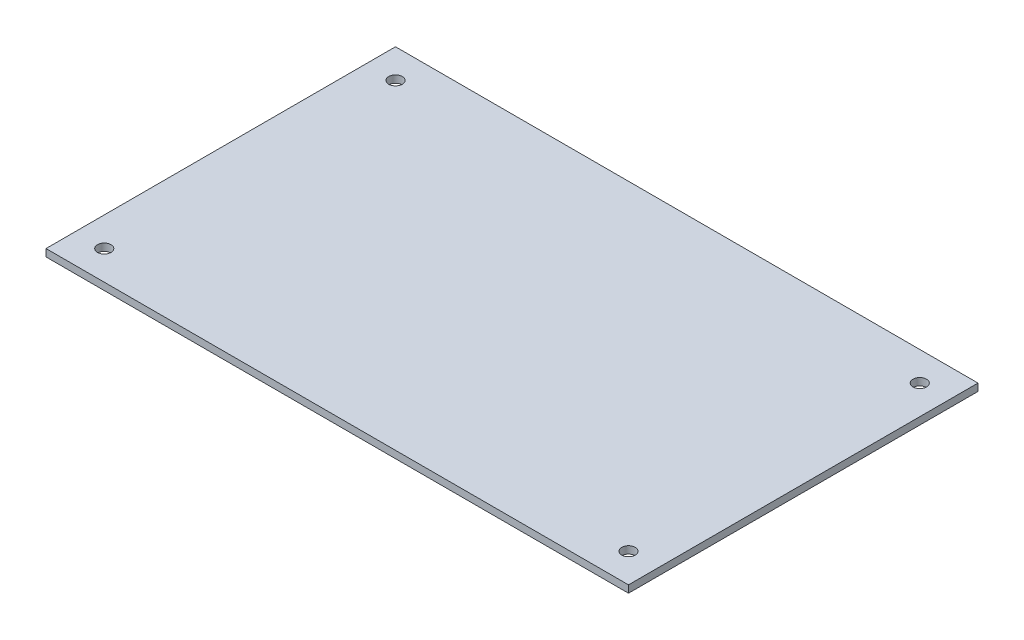
ISO-10303-21;
HEADER;
FILE_DESCRIPTION(('STEP AP214'),'2;1');
FILE_NAME('part.step','',(''),(''),'','','');
FILE_SCHEMA(('AUTOMOTIVE_DESIGN { 1 0 10303 214 1 1 1 1 }'));
ENDSEC;
DATA;
#1=APPLICATION_CONTEXT('core data for automotive mechanical design processes');
#2=APPLICATION_PROTOCOL_DEFINITION('international standard','automotive_design',2000,#1);
#3=PRODUCT_CONTEXT('',#1,'mechanical');
#4=PRODUCT('Part','Part','',(#3));
#5=PRODUCT_RELATED_PRODUCT_CATEGORY('part','',(#4));
#6=PRODUCT_DEFINITION_FORMATION('','',#4);
#7=PRODUCT_DEFINITION_CONTEXT('part definition',#1,'design');
#8=PRODUCT_DEFINITION('design','',#6,#7);
#9=PRODUCT_DEFINITION_SHAPE('','',#8);
#10=(LENGTH_UNIT() NAMED_UNIT(*) SI_UNIT(.MILLI.,.METRE.));
#11=(NAMED_UNIT(*) PLANE_ANGLE_UNIT() SI_UNIT($,.RADIAN.));
#12=(NAMED_UNIT(*) SI_UNIT($,.STERADIAN.) SOLID_ANGLE_UNIT());
#13=UNCERTAINTY_MEASURE_WITH_UNIT(LENGTH_MEASURE(1.E-05),#10,'distance_accuracy_value','');
#14=(GEOMETRIC_REPRESENTATION_CONTEXT(3) GLOBAL_UNCERTAINTY_ASSIGNED_CONTEXT((#13)) GLOBAL_UNIT_ASSIGNED_CONTEXT((#10,
#11,#12)) REPRESENTATION_CONTEXT('',''));
#15=CARTESIAN_POINT('',(0.,0.,0.));
#16=DIRECTION('',(0.,0.,1.));
#17=DIRECTION('',(1.,0.,0.));
#18=AXIS2_PLACEMENT_3D('',#15,#16,#17);
#19=CARTESIAN_POINT('',(-12.7,1.5875,-203.2));
#20=DIRECTION('',(1.,0.,0.));
#21=DIRECTION('',(0.,0.,-1.));
#22=AXIS2_PLACEMENT_3D('',#19,#20,#21);
#23=PLANE('',#22);
#24=DIRECTION('',(0.,0.,1.));
#25=VECTOR('',#24,1.);
#26=CARTESIAN_POINT('',(-12.7,0.,-203.2));
#27=LINE('',#26,#25);
#28=CARTESIAN_POINT('',(-12.7,0.,-203.2));
#29=VERTEX_POINT('',#28);
#30=CARTESIAN_POINT('',(-12.7,0.,-127.));
#31=VERTEX_POINT('',#30);
#32=EDGE_CURVE('E95',#29,#31,#27,.T.);
#33=ORIENTED_EDGE('',*,*,#32,.T.);
#34=DIRECTION('',(0.,-1.,0.));
#35=VECTOR('',#34,1.);
#36=CARTESIAN_POINT('',(-12.7,1.5875,-127.));
#37=LINE('',#36,#35);
#38=CARTESIAN_POINT('',(-12.7,1.5875,-127.));
#39=VERTEX_POINT('',#38);
#40=EDGE_CURVE('E11',#39,#31,#37,.T.);
#41=ORIENTED_EDGE('',*,*,#40,.F.);
#42=DIRECTION('',(0.,0.,1.));
#43=VECTOR('',#42,1.);
#44=CARTESIAN_POINT('',(-12.7,1.5875,-203.2));
#45=LINE('',#44,#43);
#46=CARTESIAN_POINT('',(-12.7,1.5875,-203.2));
#47=VERTEX_POINT('',#46);
#48=EDGE_CURVE('E83',#47,#39,#45,.T.);
#49=ORIENTED_EDGE('',*,*,#48,.F.);
#50=DIRECTION('',(0.,-1.,0.));
#51=VECTOR('',#50,1.);
#52=CARTESIAN_POINT('',(-12.7,1.5875,-203.2));
#53=LINE('',#52,#51);
#54=EDGE_CURVE('E91',#47,#29,#53,.T.);
#55=ORIENTED_EDGE('',*,*,#54,.T.);
#56=EDGE_LOOP('',(#33,#41,#49,#55));
#57=FACE_BOUND('',#56,.T.);
#58=ADVANCED_FACE('F32',(#57),#23,.F.);
#59=CARTESIAN_POINT('',(-12.7,1.5875,-127.));
#60=DIRECTION('',(0.,0.,-1.));
#61=DIRECTION('',(-1.,0.,0.));
#62=AXIS2_PLACEMENT_3D('',#59,#60,#61);
#63=PLANE('',#62);
#64=DIRECTION('',(1.,0.,0.));
#65=VECTOR('',#64,1.);
#66=CARTESIAN_POINT('',(-12.7,0.,-127.));
#67=LINE('',#66,#65);
#68=CARTESIAN_POINT('',(114.3,0.,-127.));
#69=VERTEX_POINT('',#68);
#70=EDGE_CURVE('E87',#31,#69,#67,.T.);
#71=ORIENTED_EDGE('',*,*,#70,.T.);
#72=DIRECTION('',(0.,-1.,0.));
#73=VECTOR('',#72,1.);
#74=CARTESIAN_POINT('',(114.3,1.5875,-127.));
#75=LINE('',#74,#73);
#76=CARTESIAN_POINT('',(114.3,1.5875,-127.));
#77=VERTEX_POINT('',#76);
#78=EDGE_CURVE('E40',#77,#69,#75,.T.);
#79=ORIENTED_EDGE('',*,*,#78,.F.);
#80=DIRECTION('',(1.,0.,0.));
#81=VECTOR('',#80,1.);
#82=CARTESIAN_POINT('',(-12.7,1.5875,-127.));
#83=LINE('',#82,#81);
#84=EDGE_CURVE('E78',#39,#77,#83,.T.);
#85=ORIENTED_EDGE('',*,*,#84,.F.);
#86=ORIENTED_EDGE('',*,*,#40,.T.);
#87=EDGE_LOOP('',(#71,#79,#85,#86));
#88=FACE_BOUND('',#87,.T.);
#89=ADVANCED_FACE('F86',(#88),#63,.F.);
#90=CARTESIAN_POINT('',(114.3,1.5875,-203.2));
#91=DIRECTION('',(-1.,0.,0.));
#92=DIRECTION('',(0.,0.,1.));
#93=AXIS2_PLACEMENT_3D('',#90,#91,#92);
#94=PLANE('',#93);
#95=DIRECTION('',(0.,0.,-1.));
#96=VECTOR('',#95,1.);
#97=CARTESIAN_POINT('',(114.3,0.,-203.2));
#98=LINE('',#97,#96);
#99=CARTESIAN_POINT('',(114.3,0.,-203.2));
#100=VERTEX_POINT('',#99);
#101=EDGE_CURVE('E65',#69,#100,#98,.T.);
#102=ORIENTED_EDGE('',*,*,#101,.T.);
#103=DIRECTION('',(0.,-1.,0.));
#104=VECTOR('',#103,1.);
#105=CARTESIAN_POINT('',(114.3,1.5875,-203.2));
#106=LINE('',#105,#104);
#107=CARTESIAN_POINT('',(114.3,1.5875,-203.2));
#108=VERTEX_POINT('',#107);
#109=EDGE_CURVE('E88',#108,#100,#106,.T.);
#110=ORIENTED_EDGE('',*,*,#109,.F.);
#111=DIRECTION('',(0.,0.,-1.));
#112=VECTOR('',#111,1.);
#113=CARTESIAN_POINT('',(114.3,1.5875,-203.2));
#114=LINE('',#113,#112);
#115=EDGE_CURVE('E81',#77,#108,#114,.T.);
#116=ORIENTED_EDGE('',*,*,#115,.F.);
#117=ORIENTED_EDGE('',*,*,#78,.T.);
#118=EDGE_LOOP('',(#102,#110,#116,#117));
#119=FACE_BOUND('',#118,.T.);
#120=ADVANCED_FACE('F89',(#119),#94,.F.);
#121=CARTESIAN_POINT('',(-12.7,1.5875,-203.2));
#122=DIRECTION('',(0.,0.,1.));
#123=DIRECTION('',(1.,0.,0.));
#124=AXIS2_PLACEMENT_3D('',#121,#122,#123);
#125=PLANE('',#124);
#126=DIRECTION('',(-1.,0.,0.));
#127=VECTOR('',#126,1.);
#128=CARTESIAN_POINT('',(-12.7,0.,-203.2));
#129=LINE('',#128,#127);
#130=EDGE_CURVE('E71',#100,#29,#129,.T.);
#131=ORIENTED_EDGE('',*,*,#130,.T.);
#132=ORIENTED_EDGE('',*,*,#54,.F.);
#133=DIRECTION('',(-1.,0.,0.));
#134=VECTOR('',#133,1.);
#135=CARTESIAN_POINT('',(-12.7,1.5875,-203.2));
#136=LINE('',#135,#134);
#137=EDGE_CURVE('E48',#108,#47,#136,.T.);
#138=ORIENTED_EDGE('',*,*,#137,.F.);
#139=ORIENTED_EDGE('',*,*,#109,.T.);
#140=EDGE_LOOP('',(#131,#132,#138,#139));
#141=FACE_BOUND('',#140,.T.);
#142=ADVANCED_FACE('F103',(#141),#125,.F.);
#143=CARTESIAN_POINT('',(0.,1.5875,0.));
#144=DIRECTION('',(0.,1.,0.));
#145=DIRECTION('',(0.,0.,1.));
#146=AXIS2_PLACEMENT_3D('',#143,#144,#145);
#147=PLANE('',#146);
#148=CARTESIAN_POINT('',(-6.35,1.5875,-196.85));
#149=DIRECTION('',(0.,1.,0.));
#150=DIRECTION('',(0.,0.,1.));
#151=AXIS2_PLACEMENT_3D('',#148,#149,#150);
#152=CIRCLE('',#151,1.47319999999999);
#153=CARTESIAN_POINT('',(-6.35,1.5875,-195.3768));
#154=VERTEX_POINT('',#153);
#155=EDGE_CURVE('E129',#154,#154,#152,.T.);
#156=ORIENTED_EDGE('',*,*,#155,.F.);
#157=EDGE_LOOP('',(#156));
#158=FACE_BOUND('',#157,.T.);
#159=CARTESIAN_POINT('',(-6.35,1.5875,-133.35));
#160=DIRECTION('',(0.,1.,0.));
#161=DIRECTION('',(0.,0.,1.));
#162=AXIS2_PLACEMENT_3D('',#159,#160,#161);
#163=CIRCLE('',#162,1.47319999999999);
#164=CARTESIAN_POINT('',(-6.35,1.5875,-131.8768));
#165=VERTEX_POINT('',#164);
#166=EDGE_CURVE('E123',#165,#165,#163,.T.);
#167=ORIENTED_EDGE('',*,*,#166,.F.);
#168=EDGE_LOOP('',(#167));
#169=FACE_BOUND('',#168,.T.);
#170=CARTESIAN_POINT('',(107.95,1.5875,-133.35));
#171=DIRECTION('',(0.,1.,0.));
#172=DIRECTION('',(0.,0.,1.));
#173=AXIS2_PLACEMENT_3D('',#170,#171,#172);
#174=CIRCLE('',#173,1.47319999999999);
#175=CARTESIAN_POINT('',(107.95,1.5875,-131.8768));
#176=VERTEX_POINT('',#175);
#177=EDGE_CURVE('E117',#176,#176,#174,.T.);
#178=ORIENTED_EDGE('',*,*,#177,.F.);
#179=EDGE_LOOP('',(#178));
#180=FACE_BOUND('',#179,.T.);
#181=CARTESIAN_POINT('',(107.95,1.5875,-196.85));
#182=DIRECTION('',(0.,1.,0.));
#183=DIRECTION('',(0.,0.,1.));
#184=AXIS2_PLACEMENT_3D('',#181,#182,#183);
#185=CIRCLE('',#184,1.47319999999998);
#186=CARTESIAN_POINT('',(107.95,1.5875,-195.3768));
#187=VERTEX_POINT('',#186);
#188=EDGE_CURVE('E111',#187,#187,#185,.T.);
#189=ORIENTED_EDGE('',*,*,#188,.F.);
#190=EDGE_LOOP('',(#189));
#191=FACE_BOUND('',#190,.T.);
#192=ORIENTED_EDGE('',*,*,#48,.T.);
#193=ORIENTED_EDGE('',*,*,#84,.T.);
#194=ORIENTED_EDGE('',*,*,#115,.T.);
#195=ORIENTED_EDGE('',*,*,#137,.T.);
#196=EDGE_LOOP('',(#192,#193,#194,#195));
#197=FACE_BOUND('',#196,.T.);
#198=ADVANCED_FACE('F79',(#158,#169,#180,#191,#197),#147,.T.);
#199=CARTESIAN_POINT('',(0.,0.,0.));
#200=DIRECTION('',(0.,1.,0.));
#201=DIRECTION('',(0.,0.,1.));
#202=AXIS2_PLACEMENT_3D('',#199,#200,#201);
#203=PLANE('',#202);
#204=CARTESIAN_POINT('',(-6.35,0.,-196.85));
#205=DIRECTION('',(0.,1.,0.));
#206=DIRECTION('',(0.,0.,1.));
#207=AXIS2_PLACEMENT_3D('',#204,#205,#206);
#208=CIRCLE('',#207,1.4732);
#209=CARTESIAN_POINT('',(-6.35,0.,-195.3768));
#210=VERTEX_POINT('',#209);
#211=EDGE_CURVE('E126',#210,#210,#208,.T.);
#212=ORIENTED_EDGE('',*,*,#211,.T.);
#213=EDGE_LOOP('',(#212));
#214=FACE_BOUND('',#213,.T.);
#215=CARTESIAN_POINT('',(-6.35,0.,-133.35));
#216=DIRECTION('',(0.,1.,0.));
#217=DIRECTION('',(0.,0.,1.));
#218=AXIS2_PLACEMENT_3D('',#215,#216,#217);
#219=CIRCLE('',#218,1.4732);
#220=CARTESIAN_POINT('',(-6.35,0.,-131.8768));
#221=VERTEX_POINT('',#220);
#222=EDGE_CURVE('E120',#221,#221,#219,.T.);
#223=ORIENTED_EDGE('',*,*,#222,.T.);
#224=EDGE_LOOP('',(#223));
#225=FACE_BOUND('',#224,.T.);
#226=CARTESIAN_POINT('',(107.95,0.,-133.35));
#227=DIRECTION('',(0.,1.,0.));
#228=DIRECTION('',(0.,0.,1.));
#229=AXIS2_PLACEMENT_3D('',#226,#227,#228);
#230=CIRCLE('',#229,1.47319999999999);
#231=CARTESIAN_POINT('',(107.95,0.,-131.8768));
#232=VERTEX_POINT('',#231);
#233=EDGE_CURVE('E114',#232,#232,#230,.T.);
#234=ORIENTED_EDGE('',*,*,#233,.T.);
#235=EDGE_LOOP('',(#234));
#236=FACE_BOUND('',#235,.T.);
#237=CARTESIAN_POINT('',(107.95,0.,-196.85));
#238=DIRECTION('',(0.,1.,0.));
#239=DIRECTION('',(0.,0.,1.));
#240=AXIS2_PLACEMENT_3D('',#237,#238,#239);
#241=CIRCLE('',#240,1.47319999999999);
#242=CARTESIAN_POINT('',(107.95,0.,-195.3768));
#243=VERTEX_POINT('',#242);
#244=EDGE_CURVE('E98',#243,#243,#241,.T.);
#245=ORIENTED_EDGE('',*,*,#244,.T.);
#246=EDGE_LOOP('',(#245));
#247=FACE_BOUND('',#246,.T.);
#248=ORIENTED_EDGE('',*,*,#32,.F.);
#249=ORIENTED_EDGE('',*,*,#130,.F.);
#250=ORIENTED_EDGE('',*,*,#101,.F.);
#251=ORIENTED_EDGE('',*,*,#70,.F.);
#252=EDGE_LOOP('',(#248,#249,#250,#251));
#253=FACE_BOUND('',#252,.T.);
#254=ADVANCED_FACE('F106',(#214,#225,#236,#247,#253),#203,.F.);
#255=CARTESIAN_POINT('',(107.95,1.5875,-196.85));
#256=DIRECTION('',(0.,1.,0.));
#257=DIRECTION('',(0.,0.,1.));
#258=AXIS2_PLACEMENT_3D('',#255,#256,#257);
#259=CYLINDRICAL_SURFACE('',#258,1.47319999999999);
#260=ORIENTED_EDGE('',*,*,#244,.F.);
#261=EDGE_LOOP('',(#260));
#262=FACE_BOUND('',#261,.T.);
#263=ORIENTED_EDGE('',*,*,#188,.T.);
#264=EDGE_LOOP('',(#263));
#265=FACE_BOUND('',#264,.T.);
#266=ADVANCED_FACE('F144',(#262,#265),#259,.F.);
#267=CARTESIAN_POINT('',(107.95,1.5875,-133.35));
#268=DIRECTION('',(0.,1.,0.));
#269=DIRECTION('',(0.,0.,1.));
#270=AXIS2_PLACEMENT_3D('',#267,#268,#269);
#271=CYLINDRICAL_SURFACE('',#270,1.47319999999999);
#272=ORIENTED_EDGE('',*,*,#233,.F.);
#273=EDGE_LOOP('',(#272));
#274=FACE_BOUND('',#273,.T.);
#275=ORIENTED_EDGE('',*,*,#177,.T.);
#276=EDGE_LOOP('',(#275));
#277=FACE_BOUND('',#276,.T.);
#278=ADVANCED_FACE('F146',(#274,#277),#271,.F.);
#279=CARTESIAN_POINT('',(-6.35,1.5875,-133.35));
#280=DIRECTION('',(0.,1.,0.));
#281=DIRECTION('',(0.,0.,1.));
#282=AXIS2_PLACEMENT_3D('',#279,#280,#281);
#283=CYLINDRICAL_SURFACE('',#282,1.47319999999999);
#284=ORIENTED_EDGE('',*,*,#222,.F.);
#285=EDGE_LOOP('',(#284));
#286=FACE_BOUND('',#285,.T.);
#287=ORIENTED_EDGE('',*,*,#166,.T.);
#288=EDGE_LOOP('',(#287));
#289=FACE_BOUND('',#288,.T.);
#290=ADVANCED_FACE('F153',(#286,#289),#283,.F.);
#291=CARTESIAN_POINT('',(-6.35,1.5875,-196.85));
#292=DIRECTION('',(0.,1.,0.));
#293=DIRECTION('',(0.,0.,1.));
#294=AXIS2_PLACEMENT_3D('',#291,#292,#293);
#295=CYLINDRICAL_SURFACE('',#294,1.47319999999999);
#296=ORIENTED_EDGE('',*,*,#211,.F.);
#297=EDGE_LOOP('',(#296));
#298=FACE_BOUND('',#297,.T.);
#299=ORIENTED_EDGE('',*,*,#155,.T.);
#300=EDGE_LOOP('',(#299));
#301=FACE_BOUND('',#300,.T.);
#302=ADVANCED_FACE('F133',(#298,#301),#295,.F.);
#303=CLOSED_SHELL('',(#58,#89,#120,#142,#198,#254,#266,#278,#290,#302));
#304=MANIFOLD_SOLID_BREP('B2',#303);
#305=ADVANCED_BREP_SHAPE_REPRESENTATION('',(#18,#304),#14);
#306=SHAPE_DEFINITION_REPRESENTATION(#9,#305);
ENDSEC;
END-ISO-10303-21;
